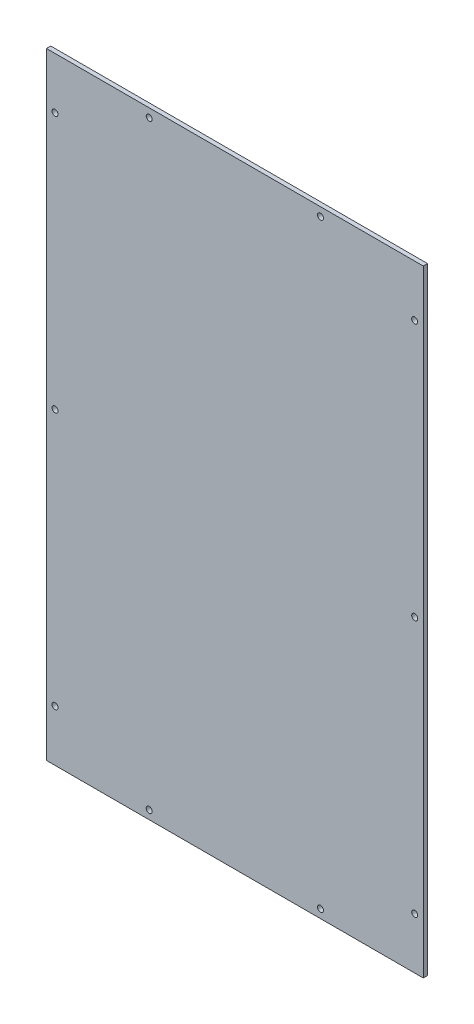
ISO-10303-21;
HEADER;
FILE_DESCRIPTION(('STEP AP214'),'2;1');
FILE_NAME('part.step','',(''),(''),'','','');
FILE_SCHEMA(('AUTOMOTIVE_DESIGN { 1 0 10303 214 1 1 1 1 }'));
ENDSEC;
DATA;
#1=APPLICATION_CONTEXT('core data for automotive mechanical design processes');
#2=APPLICATION_PROTOCOL_DEFINITION('international standard','automotive_design',2000,#1);
#3=PRODUCT_CONTEXT('',#1,'mechanical');
#4=PRODUCT('Part','Part','',(#3));
#5=PRODUCT_RELATED_PRODUCT_CATEGORY('part','',(#4));
#6=PRODUCT_DEFINITION_FORMATION('','',#4);
#7=PRODUCT_DEFINITION_CONTEXT('part definition',#1,'design');
#8=PRODUCT_DEFINITION('design','',#6,#7);
#9=PRODUCT_DEFINITION_SHAPE('','',#8);
#10=(LENGTH_UNIT() NAMED_UNIT(*) SI_UNIT(.MILLI.,.METRE.));
#11=(NAMED_UNIT(*) PLANE_ANGLE_UNIT() SI_UNIT($,.RADIAN.));
#12=(NAMED_UNIT(*) SI_UNIT($,.STERADIAN.) SOLID_ANGLE_UNIT());
#13=UNCERTAINTY_MEASURE_WITH_UNIT(LENGTH_MEASURE(1.E-05),#10,'distance_accuracy_value','');
#14=(GEOMETRIC_REPRESENTATION_CONTEXT(3) GLOBAL_UNCERTAINTY_ASSIGNED_CONTEXT((#13)) GLOBAL_UNIT_ASSIGNED_CONTEXT((#10,
#11,#12)) REPRESENTATION_CONTEXT('',''));
#15=CARTESIAN_POINT('',(0.,0.,0.));
#16=DIRECTION('',(0.,0.,1.));
#17=DIRECTION('',(1.,0.,0.));
#18=AXIS2_PLACEMENT_3D('',#15,#16,#17);
#19=CARTESIAN_POINT('',(0.,0.,-2.5));
#20=DIRECTION('',(0.,0.,-1.));
#21=DIRECTION('',(-1.,0.,0.));
#22=AXIS2_PLACEMENT_3D('',#19,#20,#21);
#23=PLANE('',#22);
#24=CARTESIAN_POINT('',(210.,300.,-2.5));
#25=DIRECTION('',(0.,0.,-1.));
#26=DIRECTION('',(-1.,0.,0.));
#27=AXIS2_PLACEMENT_3D('',#24,#25,#26);
#28=CIRCLE('',#27,3.49999999999999);
#29=CARTESIAN_POINT('',(206.5,300.,-2.5));
#30=VERTEX_POINT('',#29);
#31=EDGE_CURVE('E180',#30,#30,#28,.T.);
#32=ORIENTED_EDGE('',*,*,#31,.F.);
#33=EDGE_LOOP('',(#32));
#34=FACE_BOUND('',#33,.T.);
#35=CARTESIAN_POINT('',(100.,350.,-2.5));
#36=DIRECTION('',(0.,0.,-1.));
#37=DIRECTION('',(-1.,0.,0.));
#38=AXIS2_PLACEMENT_3D('',#35,#36,#37);
#39=CIRCLE('',#38,3.49999999999999);
#40=CARTESIAN_POINT('',(96.5,350.,-2.5));
#41=VERTEX_POINT('',#40);
#42=EDGE_CURVE('E184',#41,#41,#39,.T.);
#43=ORIENTED_EDGE('',*,*,#42,.F.);
#44=EDGE_LOOP('',(#43));
#45=FACE_BOUND('',#44,.T.);
#46=CARTESIAN_POINT('',(210.,0.,-2.5));
#47=DIRECTION('',(0.,0.,-1.));
#48=DIRECTION('',(-1.,0.,0.));
#49=AXIS2_PLACEMENT_3D('',#46,#47,#48);
#50=CIRCLE('',#49,3.49999999999999);
#51=CARTESIAN_POINT('',(206.5,0.,-2.5));
#52=VERTEX_POINT('',#51);
#53=EDGE_CURVE('E188',#52,#52,#50,.T.);
#54=ORIENTED_EDGE('',*,*,#53,.F.);
#55=EDGE_LOOP('',(#54));
#56=FACE_BOUND('',#55,.T.);
#57=CARTESIAN_POINT('',(210.000000000003,-299.999999999995,-2.5));
#58=DIRECTION('',(0.,0.,-1.));
#59=DIRECTION('',(1.,0.,0.));
#60=AXIS2_PLACEMENT_3D('',#57,#58,#59);
#61=CIRCLE('',#60,3.49999999999999);
#62=CARTESIAN_POINT('',(213.500000000003,-299.999999999995,-2.5));
#63=VERTEX_POINT('',#62);
#64=EDGE_CURVE('E192',#63,#63,#61,.T.);
#65=ORIENTED_EDGE('',*,*,#64,.F.);
#66=EDGE_LOOP('',(#65));
#67=FACE_BOUND('',#66,.T.);
#68=CARTESIAN_POINT('',(-99.999999999994,-350.000000000005,-2.5));
#69=DIRECTION('',(0.,0.,-1.));
#70=DIRECTION('',(-1.,0.,0.));
#71=AXIS2_PLACEMENT_3D('',#68,#69,#70);
#72=CIRCLE('',#71,3.49999999999996);
#73=CARTESIAN_POINT('',(-103.499999999994,-350.000000000005,-2.5));
#74=VERTEX_POINT('',#73);
#75=EDGE_CURVE('E196',#74,#74,#72,.T.);
#76=ORIENTED_EDGE('',*,*,#75,.F.);
#77=EDGE_LOOP('',(#76));
#78=FACE_BOUND('',#77,.T.);
#79=CARTESIAN_POINT('',(-210.,299.999999999999,-2.5));
#80=DIRECTION('',(0.,0.,-1.));
#81=DIRECTION('',(1.,0.,0.));
#82=AXIS2_PLACEMENT_3D('',#79,#80,#81);
#83=CIRCLE('',#82,3.49999999999999);
#84=CARTESIAN_POINT('',(-206.5,299.999999999999,-2.5));
#85=VERTEX_POINT('',#84);
#86=EDGE_CURVE('E200',#85,#85,#83,.T.);
#87=ORIENTED_EDGE('',*,*,#86,.F.);
#88=EDGE_LOOP('',(#87));
#89=FACE_BOUND('',#88,.T.);
#90=CARTESIAN_POINT('',(-209.999999999998,-1.13797860024079E-12,-2.5));
#91=DIRECTION('',(0.,0.,-1.));
#92=DIRECTION('',(1.,0.,0.));
#93=AXIS2_PLACEMENT_3D('',#90,#91,#92);
#94=CIRCLE('',#93,3.50000000000003);
#95=CARTESIAN_POINT('',(-206.499999999998,-1.13797860024079E-12,-2.5));
#96=VERTEX_POINT('',#95);
#97=EDGE_CURVE('E204',#96,#96,#94,.T.);
#98=ORIENTED_EDGE('',*,*,#97,.F.);
#99=EDGE_LOOP('',(#98));
#100=FACE_BOUND('',#99,.T.);
#101=CARTESIAN_POINT('',(-210.,-299.999999999996,-2.5));
#102=DIRECTION('',(0.,0.,-1.));
#103=DIRECTION('',(-1.,0.,0.));
#104=AXIS2_PLACEMENT_3D('',#101,#102,#103);
#105=CIRCLE('',#104,3.49999999999999);
#106=CARTESIAN_POINT('',(-213.5,-299.999999999996,-2.5));
#107=VERTEX_POINT('',#106);
#108=EDGE_CURVE('E208',#107,#107,#105,.T.);
#109=ORIENTED_EDGE('',*,*,#108,.F.);
#110=EDGE_LOOP('',(#109));
#111=FACE_BOUND('',#110,.T.);
#112=CARTESIAN_POINT('',(100.000000000006,-350.000000000002,-2.5));
#113=DIRECTION('',(0.,0.,-1.));
#114=DIRECTION('',(1.,0.,0.));
#115=AXIS2_PLACEMENT_3D('',#112,#113,#114);
#116=CIRCLE('',#115,3.5);
#117=CARTESIAN_POINT('',(103.500000000006,-350.000000000002,-2.5));
#118=VERTEX_POINT('',#117);
#119=EDGE_CURVE('E212',#118,#118,#116,.T.);
#120=ORIENTED_EDGE('',*,*,#119,.F.);
#121=EDGE_LOOP('',(#120));
#122=FACE_BOUND('',#121,.T.);
#123=CARTESIAN_POINT('',(-99.9999999999999,350.,-2.5));
#124=DIRECTION('',(0.,0.,-1.));
#125=DIRECTION('',(1.,0.,0.));
#126=AXIS2_PLACEMENT_3D('',#123,#124,#125);
#127=CIRCLE('',#126,3.49999999999999);
#128=CARTESIAN_POINT('',(-96.4999999999999,350.,-2.5));
#129=VERTEX_POINT('',#128);
#130=EDGE_CURVE('E111',#129,#129,#127,.T.);
#131=ORIENTED_EDGE('',*,*,#130,.F.);
#132=EDGE_LOOP('',(#131));
#133=FACE_BOUND('',#132,.T.);
#134=DIRECTION('',(0.,1.,0.));
#135=VECTOR('',#134,1.);
#136=CARTESIAN_POINT('',(220.,-360.,-2.5));
#137=LINE('',#136,#135);
#138=CARTESIAN_POINT('',(220.,360.,-2.5));
#139=VERTEX_POINT('',#138);
#140=CARTESIAN_POINT('',(220.,-360.,-2.5));
#141=VERTEX_POINT('',#140);
#142=EDGE_CURVE('E92',#139,#141,#137,.F.);
#143=ORIENTED_EDGE('',*,*,#142,.T.);
#144=DIRECTION('',(1.,0.,0.));
#145=VECTOR('',#144,1.);
#146=CARTESIAN_POINT('',(-220.,-360.,-2.5));
#147=LINE('',#146,#145);
#148=CARTESIAN_POINT('',(-220.,-360.,-2.5));
#149=VERTEX_POINT('',#148);
#150=EDGE_CURVE('E83',#141,#149,#147,.F.);
#151=ORIENTED_EDGE('',*,*,#150,.T.);
#152=DIRECTION('',(0.,1.,0.));
#153=VECTOR('',#152,1.);
#154=CARTESIAN_POINT('',(-220.,-360.,-2.5));
#155=LINE('',#154,#153);
#156=CARTESIAN_POINT('',(-220.,360.,-2.5));
#157=VERTEX_POINT('',#156);
#158=EDGE_CURVE('E78',#149,#157,#155,.T.);
#159=ORIENTED_EDGE('',*,*,#158,.T.);
#160=DIRECTION('',(1.,0.,0.));
#161=VECTOR('',#160,1.);
#162=CARTESIAN_POINT('',(-220.,360.,-2.5));
#163=LINE('',#162,#161);
#164=EDGE_CURVE('E95',#157,#139,#163,.T.);
#165=ORIENTED_EDGE('',*,*,#164,.T.);
#166=EDGE_LOOP('',(#143,#151,#159,#165));
#167=FACE_BOUND('',#166,.T.);
#168=ADVANCED_FACE('F42',(#34,#45,#56,#67,#78,#89,#100,#111,#122,#133,#167),#23,.T.);
#169=CARTESIAN_POINT('',(220.,-360.,2.5));
#170=DIRECTION('',(-1.,0.,0.));
#171=DIRECTION('',(0.,0.,1.));
#172=AXIS2_PLACEMENT_3D('',#169,#170,#171);
#173=PLANE('',#172);
#174=DIRECTION('',(0.,1.,0.));
#175=VECTOR('',#174,1.);
#176=CARTESIAN_POINT('',(220.,0.,2.5));
#177=LINE('',#176,#175);
#178=CARTESIAN_POINT('',(220.,360.,2.5));
#179=VERTEX_POINT('',#178);
#180=CARTESIAN_POINT('',(220.,-360.,2.5));
#181=VERTEX_POINT('',#180);
#182=EDGE_CURVE('E102',#179,#181,#177,.F.);
#183=ORIENTED_EDGE('',*,*,#182,.T.);
#184=DIRECTION('',(0.,0.,1.));
#185=VECTOR('',#184,1.);
#186=CARTESIAN_POINT('',(220.,-360.,2.5));
#187=LINE('',#186,#185);
#188=EDGE_CURVE('E88',#181,#141,#187,.F.);
#189=ORIENTED_EDGE('',*,*,#188,.T.);
#190=ORIENTED_EDGE('',*,*,#142,.F.);
#191=DIRECTION('',(0.,0.,-1.));
#192=VECTOR('',#191,1.);
#193=CARTESIAN_POINT('',(220.,360.,2.5));
#194=LINE('',#193,#192);
#195=EDGE_CURVE('E226',#139,#179,#194,.F.);
#196=ORIENTED_EDGE('',*,*,#195,.T.);
#197=EDGE_LOOP('',(#183,#189,#190,#196));
#198=FACE_BOUND('',#197,.T.);
#199=ADVANCED_FACE('F101',(#198),#173,.F.);
#200=CARTESIAN_POINT('',(-220.,-360.,2.5));
#201=DIRECTION('',(0.,1.,0.));
#202=DIRECTION('',(0.,0.,1.));
#203=AXIS2_PLACEMENT_3D('',#200,#201,#202);
#204=PLANE('',#203);
#205=DIRECTION('',(-1.,0.,0.));
#206=VECTOR('',#205,1.);
#207=CARTESIAN_POINT('',(0.,-360.,2.5));
#208=LINE('',#207,#206);
#209=CARTESIAN_POINT('',(-220.,-360.,2.5));
#210=VERTEX_POINT('',#209);
#211=EDGE_CURVE('E222',#181,#210,#208,.T.);
#212=ORIENTED_EDGE('',*,*,#211,.T.);
#213=DIRECTION('',(0.,0.,-1.));
#214=VECTOR('',#213,1.);
#215=CARTESIAN_POINT('',(-220.,-360.,2.5));
#216=LINE('',#215,#214);
#217=EDGE_CURVE('E90',#210,#149,#216,.T.);
#218=ORIENTED_EDGE('',*,*,#217,.T.);
#219=ORIENTED_EDGE('',*,*,#150,.F.);
#220=ORIENTED_EDGE('',*,*,#188,.F.);
#221=EDGE_LOOP('',(#212,#218,#219,#220));
#222=FACE_BOUND('',#221,.T.);
#223=ADVANCED_FACE('F86',(#222),#204,.F.);
#224=CARTESIAN_POINT('',(-220.,-360.,2.5));
#225=DIRECTION('',(1.,0.,0.));
#226=DIRECTION('',(0.,0.,-1.));
#227=AXIS2_PLACEMENT_3D('',#224,#225,#226);
#228=PLANE('',#227);
#229=DIRECTION('',(0.,1.,0.));
#230=VECTOR('',#229,1.);
#231=CARTESIAN_POINT('',(-220.,0.,2.5));
#232=LINE('',#231,#230);
#233=CARTESIAN_POINT('',(-220.,360.,2.5));
#234=VERTEX_POINT('',#233);
#235=EDGE_CURVE('E51',#210,#234,#232,.T.);
#236=ORIENTED_EDGE('',*,*,#235,.T.);
#237=DIRECTION('',(0.,0.,-1.));
#238=VECTOR('',#237,1.);
#239=CARTESIAN_POINT('',(-220.,360.,2.5));
#240=LINE('',#239,#238);
#241=EDGE_CURVE('E59',#234,#157,#240,.T.);
#242=ORIENTED_EDGE('',*,*,#241,.T.);
#243=ORIENTED_EDGE('',*,*,#158,.F.);
#244=ORIENTED_EDGE('',*,*,#217,.F.);
#245=EDGE_LOOP('',(#236,#242,#243,#244));
#246=FACE_BOUND('',#245,.T.);
#247=ADVANCED_FACE('F164',(#246),#228,.F.);
#248=CARTESIAN_POINT('',(-220.,360.,2.5));
#249=DIRECTION('',(0.,-1.,0.));
#250=DIRECTION('',(0.,0.,-1.));
#251=AXIS2_PLACEMENT_3D('',#248,#249,#250);
#252=PLANE('',#251);
#253=DIRECTION('',(-1.,0.,0.));
#254=VECTOR('',#253,1.);
#255=CARTESIAN_POINT('',(0.,360.,2.5));
#256=LINE('',#255,#254);
#257=EDGE_CURVE('E11',#234,#179,#256,.F.);
#258=ORIENTED_EDGE('',*,*,#257,.T.);
#259=ORIENTED_EDGE('',*,*,#195,.F.);
#260=ORIENTED_EDGE('',*,*,#164,.F.);
#261=ORIENTED_EDGE('',*,*,#241,.F.);
#262=EDGE_LOOP('',(#258,#259,#260,#261));
#263=FACE_BOUND('',#262,.T.);
#264=ADVANCED_FACE('F155',(#263),#252,.F.);
#265=CARTESIAN_POINT('',(0.,0.,2.5));
#266=DIRECTION('',(0.,0.,-1.));
#267=DIRECTION('',(-1.,0.,0.));
#268=AXIS2_PLACEMENT_3D('',#265,#266,#267);
#269=PLANE('',#268);
#270=CARTESIAN_POINT('',(210.,300.,2.5));
#271=DIRECTION('',(0.,0.,-1.));
#272=DIRECTION('',(-1.,0.,0.));
#273=AXIS2_PLACEMENT_3D('',#270,#271,#272);
#274=CIRCLE('',#273,3.49999999999999);
#275=CARTESIAN_POINT('',(206.5,300.,2.5));
#276=VERTEX_POINT('',#275);
#277=EDGE_CURVE('E45',#276,#276,#274,.T.);
#278=ORIENTED_EDGE('',*,*,#277,.T.);
#279=EDGE_LOOP('',(#278));
#280=FACE_BOUND('',#279,.T.);
#281=CARTESIAN_POINT('',(100.,350.,2.5));
#282=DIRECTION('',(0.,0.,-1.));
#283=DIRECTION('',(-1.,0.,0.));
#284=AXIS2_PLACEMENT_3D('',#281,#282,#283);
#285=CIRCLE('',#284,3.49999999999999);
#286=CARTESIAN_POINT('',(96.5,350.,2.5));
#287=VERTEX_POINT('',#286);
#288=EDGE_CURVE('E131',#287,#287,#285,.T.);
#289=ORIENTED_EDGE('',*,*,#288,.T.);
#290=EDGE_LOOP('',(#289));
#291=FACE_BOUND('',#290,.T.);
#292=CARTESIAN_POINT('',(210.,0.,2.5));
#293=DIRECTION('',(0.,0.,-1.));
#294=DIRECTION('',(-1.,0.,0.));
#295=AXIS2_PLACEMENT_3D('',#292,#293,#294);
#296=CIRCLE('',#295,3.49999999999999);
#297=CARTESIAN_POINT('',(206.5,0.,2.5));
#298=VERTEX_POINT('',#297);
#299=EDGE_CURVE('E129',#298,#298,#296,.T.);
#300=ORIENTED_EDGE('',*,*,#299,.T.);
#301=EDGE_LOOP('',(#300));
#302=FACE_BOUND('',#301,.T.);
#303=CARTESIAN_POINT('',(210.000000000003,-299.999999999995,2.5));
#304=DIRECTION('',(0.,0.,-1.));
#305=DIRECTION('',(-1.,0.,0.));
#306=AXIS2_PLACEMENT_3D('',#303,#304,#305);
#307=CIRCLE('',#306,3.49999999999999);
#308=CARTESIAN_POINT('',(206.500000000003,-299.999999999995,2.5));
#309=VERTEX_POINT('',#308);
#310=EDGE_CURVE('E126',#309,#309,#307,.T.);
#311=ORIENTED_EDGE('',*,*,#310,.T.);
#312=EDGE_LOOP('',(#311));
#313=FACE_BOUND('',#312,.T.);
#314=CARTESIAN_POINT('',(-99.999999999994,-350.000000000005,2.5));
#315=DIRECTION('',(0.,0.,-1.));
#316=DIRECTION('',(-1.,0.,0.));
#317=AXIS2_PLACEMENT_3D('',#314,#315,#316);
#318=CIRCLE('',#317,3.49999999999996);
#319=CARTESIAN_POINT('',(-103.499999999994,-350.000000000005,2.5));
#320=VERTEX_POINT('',#319);
#321=EDGE_CURVE('E123',#320,#320,#318,.T.);
#322=ORIENTED_EDGE('',*,*,#321,.T.);
#323=EDGE_LOOP('',(#322));
#324=FACE_BOUND('',#323,.T.);
#325=CARTESIAN_POINT('',(-210.,299.999999999999,2.5));
#326=DIRECTION('',(0.,0.,-1.));
#327=DIRECTION('',(-1.,0.,0.));
#328=AXIS2_PLACEMENT_3D('',#325,#326,#327);
#329=CIRCLE('',#328,3.49999999999999);
#330=CARTESIAN_POINT('',(-213.5,299.999999999999,2.5));
#331=VERTEX_POINT('',#330);
#332=EDGE_CURVE('E120',#331,#331,#329,.T.);
#333=ORIENTED_EDGE('',*,*,#332,.T.);
#334=EDGE_LOOP('',(#333));
#335=FACE_BOUND('',#334,.T.);
#336=CARTESIAN_POINT('',(-209.999999999998,-1.13797860024079E-12,2.5));
#337=DIRECTION('',(0.,0.,-1.));
#338=DIRECTION('',(-1.,0.,0.));
#339=AXIS2_PLACEMENT_3D('',#336,#337,#338);
#340=CIRCLE('',#339,3.50000000000003);
#341=CARTESIAN_POINT('',(-213.499999999998,-1.13797860024079E-12,2.5));
#342=VERTEX_POINT('',#341);
#343=EDGE_CURVE('E117',#342,#342,#340,.T.);
#344=ORIENTED_EDGE('',*,*,#343,.T.);
#345=EDGE_LOOP('',(#344));
#346=FACE_BOUND('',#345,.T.);
#347=CARTESIAN_POINT('',(-210.,-299.999999999996,2.5));
#348=DIRECTION('',(0.,0.,-1.));
#349=DIRECTION('',(-1.,0.,0.));
#350=AXIS2_PLACEMENT_3D('',#347,#348,#349);
#351=CIRCLE('',#350,3.49999999999999);
#352=CARTESIAN_POINT('',(-213.5,-299.999999999996,2.5));
#353=VERTEX_POINT('',#352);
#354=EDGE_CURVE('E114',#353,#353,#351,.T.);
#355=ORIENTED_EDGE('',*,*,#354,.T.);
#356=EDGE_LOOP('',(#355));
#357=FACE_BOUND('',#356,.T.);
#358=CARTESIAN_POINT('',(100.000000000006,-350.000000000002,2.5));
#359=DIRECTION('',(0.,0.,-1.));
#360=DIRECTION('',(-1.,0.,0.));
#361=AXIS2_PLACEMENT_3D('',#358,#359,#360);
#362=CIRCLE('',#361,3.5);
#363=CARTESIAN_POINT('',(96.5000000000058,-350.000000000002,2.5));
#364=VERTEX_POINT('',#363);
#365=EDGE_CURVE('E110',#364,#364,#362,.T.);
#366=ORIENTED_EDGE('',*,*,#365,.T.);
#367=EDGE_LOOP('',(#366));
#368=FACE_BOUND('',#367,.T.);
#369=CARTESIAN_POINT('',(-99.9999999999999,350.,2.5));
#370=DIRECTION('',(0.,0.,-1.));
#371=DIRECTION('',(-1.,0.,0.));
#372=AXIS2_PLACEMENT_3D('',#369,#370,#371);
#373=CIRCLE('',#372,3.49999999999999);
#374=CARTESIAN_POINT('',(-103.5,350.,2.5));
#375=VERTEX_POINT('',#374);
#376=EDGE_CURVE('E107',#375,#375,#373,.T.);
#377=ORIENTED_EDGE('',*,*,#376,.T.);
#378=EDGE_LOOP('',(#377));
#379=FACE_BOUND('',#378,.T.);
#380=ORIENTED_EDGE('',*,*,#235,.F.);
#381=ORIENTED_EDGE('',*,*,#211,.F.);
#382=ORIENTED_EDGE('',*,*,#182,.F.);
#383=ORIENTED_EDGE('',*,*,#257,.F.);
#384=EDGE_LOOP('',(#380,#381,#382,#383));
#385=FACE_BOUND('',#384,.T.);
#386=ADVANCED_FACE('F138',(#280,#291,#302,#313,#324,#335,#346,#357,#368,#379,#385),#269,.F.);
#387=CARTESIAN_POINT('',(-99.9999999999999,350.,7.5));
#388=DIRECTION('',(0.,0.,-1.));
#389=DIRECTION('',(-1.,0.,0.));
#390=AXIS2_PLACEMENT_3D('',#387,#388,#389);
#391=CYLINDRICAL_SURFACE('',#390,3.49999999999999);
#392=ORIENTED_EDGE('',*,*,#130,.T.);
#393=EDGE_LOOP('',(#392));
#394=FACE_BOUND('',#393,.T.);
#395=ORIENTED_EDGE('',*,*,#376,.F.);
#396=EDGE_LOOP('',(#395));
#397=FACE_BOUND('',#396,.T.);
#398=ADVANCED_FACE('F154',(#394,#397),#391,.F.);
#399=CARTESIAN_POINT('',(100.000000000006,-350.000000000002,7.5));
#400=DIRECTION('',(0.,0.,-1.));
#401=DIRECTION('',(-1.,0.,0.));
#402=AXIS2_PLACEMENT_3D('',#399,#400,#401);
#403=CYLINDRICAL_SURFACE('',#402,3.5);
#404=ORIENTED_EDGE('',*,*,#119,.T.);
#405=EDGE_LOOP('',(#404));
#406=FACE_BOUND('',#405,.T.);
#407=ORIENTED_EDGE('',*,*,#365,.F.);
#408=EDGE_LOOP('',(#407));
#409=FACE_BOUND('',#408,.T.);
#410=ADVANCED_FACE('F161',(#406,#409),#403,.F.);
#411=CARTESIAN_POINT('',(-210.,-299.999999999996,7.5));
#412=DIRECTION('',(0.,0.,-1.));
#413=DIRECTION('',(-1.,0.,0.));
#414=AXIS2_PLACEMENT_3D('',#411,#412,#413);
#415=CYLINDRICAL_SURFACE('',#414,3.49999999999999);
#416=ORIENTED_EDGE('',*,*,#108,.T.);
#417=EDGE_LOOP('',(#416));
#418=FACE_BOUND('',#417,.T.);
#419=ORIENTED_EDGE('',*,*,#354,.F.);
#420=EDGE_LOOP('',(#419));
#421=FACE_BOUND('',#420,.T.);
#422=ADVANCED_FACE('F239',(#418,#421),#415,.F.);
#423=CARTESIAN_POINT('',(-209.999999999998,-1.13797860024079E-12,7.5));
#424=DIRECTION('',(0.,0.,-1.));
#425=DIRECTION('',(-1.,0.,0.));
#426=AXIS2_PLACEMENT_3D('',#423,#424,#425);
#427=CYLINDRICAL_SURFACE('',#426,3.50000000000003);
#428=ORIENTED_EDGE('',*,*,#97,.T.);
#429=EDGE_LOOP('',(#428));
#430=FACE_BOUND('',#429,.T.);
#431=ORIENTED_EDGE('',*,*,#343,.F.);
#432=EDGE_LOOP('',(#431));
#433=FACE_BOUND('',#432,.T.);
#434=ADVANCED_FACE('F248',(#430,#433),#427,.F.);
#435=CARTESIAN_POINT('',(-210.,299.999999999999,7.5));
#436=DIRECTION('',(0.,0.,-1.));
#437=DIRECTION('',(-1.,0.,0.));
#438=AXIS2_PLACEMENT_3D('',#435,#436,#437);
#439=CYLINDRICAL_SURFACE('',#438,3.49999999999999);
#440=ORIENTED_EDGE('',*,*,#86,.T.);
#441=EDGE_LOOP('',(#440));
#442=FACE_BOUND('',#441,.T.);
#443=ORIENTED_EDGE('',*,*,#332,.F.);
#444=EDGE_LOOP('',(#443));
#445=FACE_BOUND('',#444,.T.);
#446=ADVANCED_FACE('F254',(#442,#445),#439,.F.);
#447=CARTESIAN_POINT('',(-99.999999999994,-350.000000000005,7.5));
#448=DIRECTION('',(0.,0.,-1.));
#449=DIRECTION('',(-1.,0.,0.));
#450=AXIS2_PLACEMENT_3D('',#447,#448,#449);
#451=CYLINDRICAL_SURFACE('',#450,3.49999999999996);
#452=ORIENTED_EDGE('',*,*,#75,.T.);
#453=EDGE_LOOP('',(#452));
#454=FACE_BOUND('',#453,.T.);
#455=ORIENTED_EDGE('',*,*,#321,.F.);
#456=EDGE_LOOP('',(#455));
#457=FACE_BOUND('',#456,.T.);
#458=ADVANCED_FACE('F258',(#454,#457),#451,.F.);
#459=CARTESIAN_POINT('',(210.000000000003,-299.999999999995,7.5));
#460=DIRECTION('',(0.,0.,-1.));
#461=DIRECTION('',(-1.,0.,0.));
#462=AXIS2_PLACEMENT_3D('',#459,#460,#461);
#463=CYLINDRICAL_SURFACE('',#462,3.49999999999999);
#464=ORIENTED_EDGE('',*,*,#64,.T.);
#465=EDGE_LOOP('',(#464));
#466=FACE_BOUND('',#465,.T.);
#467=ORIENTED_EDGE('',*,*,#310,.F.);
#468=EDGE_LOOP('',(#467));
#469=FACE_BOUND('',#468,.T.);
#470=ADVANCED_FACE('F261',(#466,#469),#463,.F.);
#471=CARTESIAN_POINT('',(210.,0.,7.5));
#472=DIRECTION('',(0.,0.,-1.));
#473=DIRECTION('',(-1.,0.,0.));
#474=AXIS2_PLACEMENT_3D('',#471,#472,#473);
#475=CYLINDRICAL_SURFACE('',#474,3.49999999999999);
#476=ORIENTED_EDGE('',*,*,#53,.T.);
#477=EDGE_LOOP('',(#476));
#478=FACE_BOUND('',#477,.T.);
#479=ORIENTED_EDGE('',*,*,#299,.F.);
#480=EDGE_LOOP('',(#479));
#481=FACE_BOUND('',#480,.T.);
#482=ADVANCED_FACE('F148',(#478,#481),#475,.F.);
#483=CARTESIAN_POINT('',(100.,350.,7.5));
#484=DIRECTION('',(0.,0.,-1.));
#485=DIRECTION('',(-1.,0.,0.));
#486=AXIS2_PLACEMENT_3D('',#483,#484,#485);
#487=CYLINDRICAL_SURFACE('',#486,3.49999999999999);
#488=ORIENTED_EDGE('',*,*,#42,.T.);
#489=EDGE_LOOP('',(#488));
#490=FACE_BOUND('',#489,.T.);
#491=ORIENTED_EDGE('',*,*,#288,.F.);
#492=EDGE_LOOP('',(#491));
#493=FACE_BOUND('',#492,.T.);
#494=ADVANCED_FACE('F142',(#490,#493),#487,.F.);
#495=CARTESIAN_POINT('',(210.,300.,7.5));
#496=DIRECTION('',(0.,0.,-1.));
#497=DIRECTION('',(-1.,0.,0.));
#498=AXIS2_PLACEMENT_3D('',#495,#496,#497);
#499=CYLINDRICAL_SURFACE('',#498,3.49999999999999);
#500=ORIENTED_EDGE('',*,*,#31,.T.);
#501=EDGE_LOOP('',(#500));
#502=FACE_BOUND('',#501,.T.);
#503=ORIENTED_EDGE('',*,*,#277,.F.);
#504=EDGE_LOOP('',(#503));
#505=FACE_BOUND('',#504,.T.);
#506=ADVANCED_FACE('F140',(#502,#505),#499,.F.);
#507=CLOSED_SHELL('',(#168,#199,#223,#247,#264,#386,#398,#410,#422,#434,#446,#458,#470,#482,
#494,#506));
#508=MANIFOLD_SOLID_BREP('B2',#507);
#509=ADVANCED_BREP_SHAPE_REPRESENTATION('',(#18,#508),#14);
#510=SHAPE_DEFINITION_REPRESENTATION(#9,#509);
ENDSEC;
END-ISO-10303-21;
